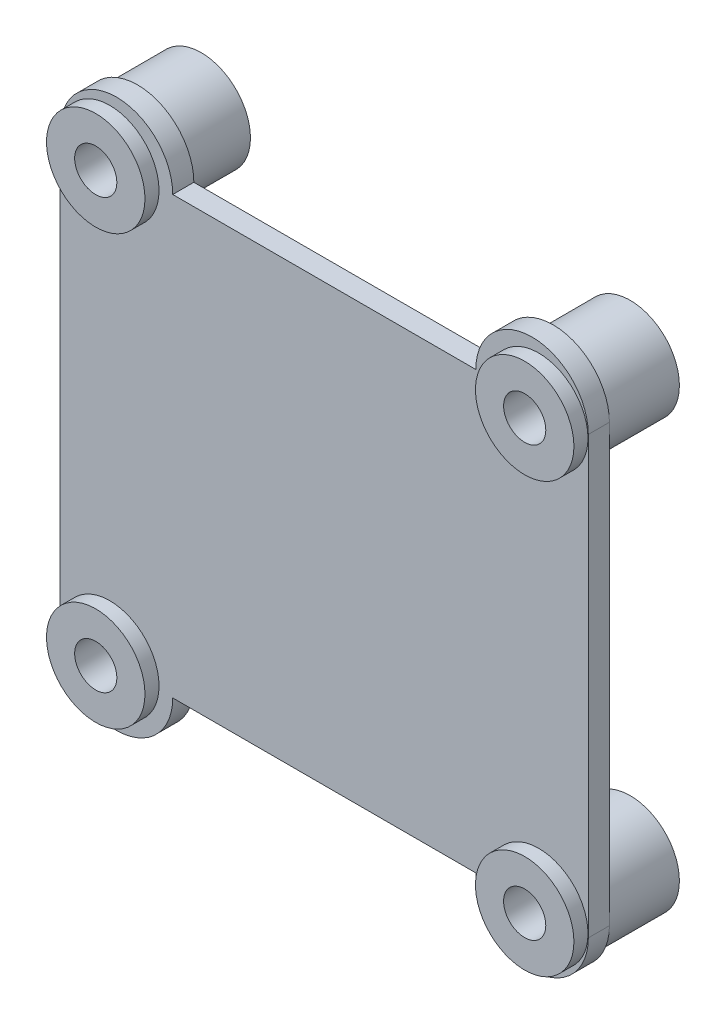
ISO-10303-21;
HEADER;
FILE_DESCRIPTION(('STEP AP214'),'2;1');
FILE_NAME('part.step','',(''),(''),'','','');
FILE_SCHEMA(('AUTOMOTIVE_DESIGN { 1 0 10303 214 1 1 1 1 }'));
ENDSEC;
DATA;
#1=APPLICATION_CONTEXT('core data for automotive mechanical design processes');
#2=APPLICATION_PROTOCOL_DEFINITION('international standard','automotive_design',2000,#1);
#3=PRODUCT_CONTEXT('',#1,'mechanical');
#4=PRODUCT('Part','Part','',(#3));
#5=PRODUCT_RELATED_PRODUCT_CATEGORY('part','',(#4));
#6=PRODUCT_DEFINITION_FORMATION('','',#4);
#7=PRODUCT_DEFINITION_CONTEXT('part definition',#1,'design');
#8=PRODUCT_DEFINITION('design','',#6,#7);
#9=PRODUCT_DEFINITION_SHAPE('','',#8);
#10=(LENGTH_UNIT() NAMED_UNIT(*) SI_UNIT(.MILLI.,.METRE.));
#11=(NAMED_UNIT(*) PLANE_ANGLE_UNIT() SI_UNIT($,.RADIAN.));
#12=(NAMED_UNIT(*) SI_UNIT($,.STERADIAN.) SOLID_ANGLE_UNIT());
#13=UNCERTAINTY_MEASURE_WITH_UNIT(LENGTH_MEASURE(1.E-05),#10,'distance_accuracy_value','');
#14=(GEOMETRIC_REPRESENTATION_CONTEXT(3) GLOBAL_UNCERTAINTY_ASSIGNED_CONTEXT((#13)) GLOBAL_UNIT_ASSIGNED_CONTEXT((#10,
#11,#12)) REPRESENTATION_CONTEXT('',''));
#15=CARTESIAN_POINT('',(0.,0.,0.));
#16=DIRECTION('',(0.,0.,1.));
#17=DIRECTION('',(1.,0.,0.));
#18=AXIS2_PLACEMENT_3D('',#15,#16,#17);
#19=CARTESIAN_POINT('',(13.8832261201287,-17.3040229885057,1.5));
#20=DIRECTION('',(0.,0.,-1.));
#21=DIRECTION('',(-1.,0.,0.));
#22=AXIS2_PLACEMENT_3D('',#19,#20,#21);
#23=PLANE('',#22);
#24=CARTESIAN_POINT('',(14.358226120129,13.4459770114943,1.5));
#25=DIRECTION('',(0.,0.,1.));
#26=DIRECTION('',(1.,0.,0.));
#27=AXIS2_PLACEMENT_3D('',#24,#25,#26);
#28=CIRCLE('',#27,3.5);
#29=CARTESIAN_POINT('',(17.858226120129,13.4459770114943,1.5));
#30=VERTEX_POINT('',#29);
#31=EDGE_CURVE('E283',#30,#30,#28,.T.);
#32=ORIENTED_EDGE('',*,*,#31,.F.);
#33=EDGE_LOOP('',(#32));
#34=FACE_BOUND('',#33,.T.);
#35=CARTESIAN_POINT('',(14.358226120129,-17.0540229885057,1.5));
#36=DIRECTION('',(0.,0.,1.));
#37=DIRECTION('',(1.,0.,0.));
#38=AXIS2_PLACEMENT_3D('',#35,#36,#37);
#39=CIRCLE('',#38,3.5);
#40=CARTESIAN_POINT('',(17.858226120129,-17.0540229885057,1.5));
#41=VERTEX_POINT('',#40);
#42=EDGE_CURVE('E299',#41,#41,#39,.T.);
#43=ORIENTED_EDGE('',*,*,#42,.F.);
#44=EDGE_LOOP('',(#43));
#45=FACE_BOUND('',#44,.T.);
#46=CARTESIAN_POINT('',(-16.141773879871,13.4459770114942,1.5));
#47=DIRECTION('',(0.,0.,1.));
#48=DIRECTION('',(1.,0.,0.));
#49=AXIS2_PLACEMENT_3D('',#46,#47,#48);
#50=CIRCLE('',#49,3.5);
#51=CARTESIAN_POINT('',(-12.641773879871,13.4459770114942,1.5));
#52=VERTEX_POINT('',#51);
#53=EDGE_CURVE('E314',#52,#52,#50,.T.);
#54=ORIENTED_EDGE('',*,*,#53,.F.);
#55=EDGE_LOOP('',(#54));
#56=FACE_BOUND('',#55,.T.);
#57=CARTESIAN_POINT('',(-16.141773879871,-17.0540229885057,1.5));
#58=DIRECTION('',(0.,0.,1.));
#59=DIRECTION('',(1.,0.,0.));
#60=AXIS2_PLACEMENT_3D('',#57,#58,#59);
#61=CIRCLE('',#60,3.5);
#62=CARTESIAN_POINT('',(-12.641773879871,-17.0540229885057,1.5));
#63=VERTEX_POINT('',#62);
#64=EDGE_CURVE('E329',#63,#63,#61,.T.);
#65=ORIENTED_EDGE('',*,*,#64,.F.);
#66=EDGE_LOOP('',(#65));
#67=FACE_BOUND('',#66,.T.);
#68=CARTESIAN_POINT('',(13.8832261201287,-17.3040229885057,1.5));
#69=DIRECTION('',(0.,0.,1.));
#70=DIRECTION('',(-1.,0.,0.));
#71=AXIS2_PLACEMENT_3D('',#68,#69,#70);
#72=CIRCLE('',#71,4.);
#73=CARTESIAN_POINT('',(9.88322612012868,-17.3040229885057,1.5));
#74=VERTEX_POINT('',#73);
#75=CARTESIAN_POINT('',(17.8832261201287,-17.3040229885057,1.5));
#76=VERTEX_POINT('',#75);
#77=EDGE_CURVE('E147',#74,#76,#72,.T.);
#78=ORIENTED_EDGE('',*,*,#77,.T.);
#79=DIRECTION('',(0.,1.,0.));
#80=VECTOR('',#79,1.);
#81=CARTESIAN_POINT('',(17.8832261201287,13.6959770114942,1.5));
#82=LINE('',#81,#80);
#83=CARTESIAN_POINT('',(17.8832261201287,13.6959770114942,1.5));
#84=VERTEX_POINT('',#83);
#85=EDGE_CURVE('E96',#76,#84,#82,.T.);
#86=ORIENTED_EDGE('',*,*,#85,.T.);
#87=CARTESIAN_POINT('',(13.8832261201287,13.6959770114942,1.5));
#88=DIRECTION('',(0.,0.,1.));
#89=DIRECTION('',(1.,0.,0.));
#90=AXIS2_PLACEMENT_3D('',#87,#88,#89);
#91=CIRCLE('',#90,4.);
#92=CARTESIAN_POINT('',(9.88322612012868,13.6959770114942,1.5));
#93=VERTEX_POINT('',#92);
#94=EDGE_CURVE('E345',#84,#93,#91,.T.);
#95=ORIENTED_EDGE('',*,*,#94,.T.);
#96=DIRECTION('',(-1.,0.,0.));
#97=VECTOR('',#96,1.);
#98=CARTESIAN_POINT('',(-11.6667738798713,13.6959770114942,1.5));
#99=LINE('',#98,#97);
#100=CARTESIAN_POINT('',(-11.6667738798713,13.6959770114942,1.5));
#101=VERTEX_POINT('',#100);
#102=EDGE_CURVE('E347',#93,#101,#99,.T.);
#103=ORIENTED_EDGE('',*,*,#102,.T.);
#104=CARTESIAN_POINT('',(-15.6667738798713,13.6959770114942,1.5));
#105=DIRECTION('',(0.,0.,1.));
#106=DIRECTION('',(1.,0.,0.));
#107=AXIS2_PLACEMENT_3D('',#104,#105,#106);
#108=CIRCLE('',#107,4.);
#109=CARTESIAN_POINT('',(-19.6667738798713,13.6959770114942,1.5));
#110=VERTEX_POINT('',#109);
#111=EDGE_CURVE('E114',#101,#110,#108,.T.);
#112=ORIENTED_EDGE('',*,*,#111,.T.);
#113=DIRECTION('',(0.,-1.,0.));
#114=VECTOR('',#113,1.);
#115=CARTESIAN_POINT('',(-19.6667738798713,13.6959770114942,1.5));
#116=LINE('',#115,#114);
#117=CARTESIAN_POINT('',(-19.6667738798713,-17.3040229885057,1.5));
#118=VERTEX_POINT('',#117);
#119=EDGE_CURVE('E109',#110,#118,#116,.T.);
#120=ORIENTED_EDGE('',*,*,#119,.T.);
#121=CARTESIAN_POINT('',(-15.6667738798713,-17.3040229885057,1.5));
#122=DIRECTION('',(0.,0.,1.));
#123=DIRECTION('',(-1.,0.,0.));
#124=AXIS2_PLACEMENT_3D('',#121,#122,#123);
#125=CIRCLE('',#124,4.);
#126=CARTESIAN_POINT('',(-11.6667738798713,-17.3040229885057,1.5));
#127=VERTEX_POINT('',#126);
#128=EDGE_CURVE('E112',#118,#127,#125,.T.);
#129=ORIENTED_EDGE('',*,*,#128,.T.);
#130=DIRECTION('',(1.,0.,0.));
#131=VECTOR('',#130,1.);
#132=CARTESIAN_POINT('',(-11.6667738798713,-17.3040229885057,1.5));
#133=LINE('',#132,#131);
#134=EDGE_CURVE('E52',#127,#74,#133,.T.);
#135=ORIENTED_EDGE('',*,*,#134,.T.);
#136=EDGE_LOOP('',(#78,#86,#95,#103,#112,#120,#129,#135));
#137=FACE_BOUND('',#136,.T.);
#138=ADVANCED_FACE('F35',(#34,#45,#56,#67,#137),#23,.F.);
#139=CARTESIAN_POINT('',(13.8832261201287,-17.3040229885057,0.));
#140=DIRECTION('',(0.,0.,-1.));
#141=DIRECTION('',(-1.,0.,0.));
#142=AXIS2_PLACEMENT_3D('',#139,#140,#141);
#143=PLANE('',#142);
#144=CARTESIAN_POINT('',(14.358226120129,13.4459770114943,0.));
#145=DIRECTION('',(0.,0.,-1.));
#146=DIRECTION('',(-1.,0.,0.));
#147=AXIS2_PLACEMENT_3D('',#144,#145,#146);
#148=CIRCLE('',#147,3.5);
#149=CARTESIAN_POINT('',(10.858226120129,13.4459770114943,0.));
#150=VERTEX_POINT('',#149);
#151=EDGE_CURVE('E11',#150,#150,#148,.T.);
#152=ORIENTED_EDGE('',*,*,#151,.F.);
#153=EDGE_LOOP('',(#152));
#154=FACE_BOUND('',#153,.T.);
#155=CARTESIAN_POINT('',(14.358226120129,-17.0540229885057,0.));
#156=DIRECTION('',(0.,0.,-1.));
#157=DIRECTION('',(-1.,0.,0.));
#158=AXIS2_PLACEMENT_3D('',#155,#156,#157);
#159=CIRCLE('',#158,3.5);
#160=CARTESIAN_POINT('',(10.858226120129,-17.0540229885057,0.));
#161=VERTEX_POINT('',#160);
#162=EDGE_CURVE('E44',#161,#161,#159,.T.);
#163=ORIENTED_EDGE('',*,*,#162,.F.);
#164=EDGE_LOOP('',(#163));
#165=FACE_BOUND('',#164,.T.);
#166=CARTESIAN_POINT('',(-16.141773879871,13.4459770114942,0.));
#167=DIRECTION('',(0.,0.,-1.));
#168=DIRECTION('',(-1.,0.,0.));
#169=AXIS2_PLACEMENT_3D('',#166,#167,#168);
#170=CIRCLE('',#169,3.5);
#171=CARTESIAN_POINT('',(-19.641773879871,13.4459770114942,0.));
#172=VERTEX_POINT('',#171);
#173=EDGE_CURVE('E165',#172,#172,#170,.T.);
#174=ORIENTED_EDGE('',*,*,#173,.F.);
#175=EDGE_LOOP('',(#174));
#176=FACE_BOUND('',#175,.T.);
#177=CARTESIAN_POINT('',(-16.141773879871,-17.0540229885057,0.));
#178=DIRECTION('',(0.,0.,-1.));
#179=DIRECTION('',(-1.,0.,0.));
#180=AXIS2_PLACEMENT_3D('',#177,#178,#179);
#181=CIRCLE('',#180,3.5);
#182=CARTESIAN_POINT('',(-19.641773879871,-17.0540229885057,0.));
#183=VERTEX_POINT('',#182);
#184=EDGE_CURVE('E162',#183,#183,#181,.T.);
#185=ORIENTED_EDGE('',*,*,#184,.F.);
#186=EDGE_LOOP('',(#185));
#187=FACE_BOUND('',#186,.T.);
#188=CARTESIAN_POINT('',(13.8832261201287,-17.3040229885057,0.));
#189=DIRECTION('',(0.,0.,1.));
#190=DIRECTION('',(-1.,0.,0.));
#191=AXIS2_PLACEMENT_3D('',#188,#189,#190);
#192=CIRCLE('',#191,4.);
#193=CARTESIAN_POINT('',(9.88322612012868,-17.3040229885057,0.));
#194=VERTEX_POINT('',#193);
#195=CARTESIAN_POINT('',(17.8832261201287,-17.3040229885057,0.));
#196=VERTEX_POINT('',#195);
#197=EDGE_CURVE('E132',#194,#196,#192,.T.);
#198=ORIENTED_EDGE('',*,*,#197,.F.);
#199=DIRECTION('',(1.,0.,0.));
#200=VECTOR('',#199,1.);
#201=CARTESIAN_POINT('',(-11.6667738798713,-17.3040229885057,0.));
#202=LINE('',#201,#200);
#203=CARTESIAN_POINT('',(-11.6667738798713,-17.3040229885057,0.));
#204=VERTEX_POINT('',#203);
#205=EDGE_CURVE('E87',#204,#194,#202,.T.);
#206=ORIENTED_EDGE('',*,*,#205,.F.);
#207=CARTESIAN_POINT('',(-15.6667738798713,-17.3040229885057,0.));
#208=DIRECTION('',(0.,0.,1.));
#209=DIRECTION('',(-1.,0.,0.));
#210=AXIS2_PLACEMENT_3D('',#207,#208,#209);
#211=CIRCLE('',#210,4.);
#212=CARTESIAN_POINT('',(-19.6667738798713,-17.3040229885057,0.));
#213=VERTEX_POINT('',#212);
#214=EDGE_CURVE('E81',#213,#204,#211,.T.);
#215=ORIENTED_EDGE('',*,*,#214,.F.);
#216=DIRECTION('',(0.,-1.,0.));
#217=VECTOR('',#216,1.);
#218=CARTESIAN_POINT('',(-19.6667738798713,13.6959770114942,0.));
#219=LINE('',#218,#217);
#220=CARTESIAN_POINT('',(-19.6667738798713,13.6959770114942,0.));
#221=VERTEX_POINT('',#220);
#222=EDGE_CURVE('E122',#221,#213,#219,.T.);
#223=ORIENTED_EDGE('',*,*,#222,.F.);
#224=CARTESIAN_POINT('',(-15.6667738798713,13.6959770114942,0.));
#225=DIRECTION('',(0.,0.,1.));
#226=DIRECTION('',(1.,0.,0.));
#227=AXIS2_PLACEMENT_3D('',#224,#225,#226);
#228=CIRCLE('',#227,4.);
#229=CARTESIAN_POINT('',(-11.6667738798713,13.6959770114942,0.));
#230=VERTEX_POINT('',#229);
#231=EDGE_CURVE('E142',#230,#221,#228,.T.);
#232=ORIENTED_EDGE('',*,*,#231,.F.);
#233=DIRECTION('',(-1.,0.,0.));
#234=VECTOR('',#233,1.);
#235=CARTESIAN_POINT('',(-11.6667738798713,13.6959770114942,0.));
#236=LINE('',#235,#234);
#237=CARTESIAN_POINT('',(9.88322612012868,13.6959770114942,0.));
#238=VERTEX_POINT('',#237);
#239=EDGE_CURVE('E140',#238,#230,#236,.T.);
#240=ORIENTED_EDGE('',*,*,#239,.F.);
#241=CARTESIAN_POINT('',(13.8832261201287,13.6959770114942,0.));
#242=DIRECTION('',(0.,0.,1.));
#243=DIRECTION('',(1.,0.,0.));
#244=AXIS2_PLACEMENT_3D('',#241,#242,#243);
#245=CIRCLE('',#244,4.);
#246=CARTESIAN_POINT('',(17.8832261201287,13.6959770114942,0.));
#247=VERTEX_POINT('',#246);
#248=EDGE_CURVE('E138',#247,#238,#245,.T.);
#249=ORIENTED_EDGE('',*,*,#248,.F.);
#250=DIRECTION('',(0.,1.,0.));
#251=VECTOR('',#250,1.);
#252=CARTESIAN_POINT('',(17.8832261201287,13.6959770114942,0.));
#253=LINE('',#252,#251);
#254=EDGE_CURVE('E135',#196,#247,#253,.T.);
#255=ORIENTED_EDGE('',*,*,#254,.F.);
#256=EDGE_LOOP('',(#198,#206,#215,#223,#232,#240,#249,#255));
#257=FACE_BOUND('',#256,.T.);
#258=ADVANCED_FACE('F172',(#154,#165,#176,#187,#257),#143,.T.);
#259=CARTESIAN_POINT('',(13.8832261201287,-17.3040229885057,1.5));
#260=DIRECTION('',(0.,0.,-1.));
#261=DIRECTION('',(-1.,0.,0.));
#262=AXIS2_PLACEMENT_3D('',#259,#260,#261);
#263=CYLINDRICAL_SURFACE('',#262,4.);
#264=ORIENTED_EDGE('',*,*,#197,.T.);
#265=DIRECTION('',(0.,0.,-1.));
#266=VECTOR('',#265,1.);
#267=CARTESIAN_POINT('',(17.8832261201287,-17.3040229885057,1.5));
#268=LINE('',#267,#266);
#269=EDGE_CURVE('E160',#76,#196,#268,.T.);
#270=ORIENTED_EDGE('',*,*,#269,.F.);
#271=ORIENTED_EDGE('',*,*,#77,.F.);
#272=DIRECTION('',(0.,0.,-1.));
#273=VECTOR('',#272,1.);
#274=CARTESIAN_POINT('',(9.88322612012868,-17.3040229885057,1.5));
#275=LINE('',#274,#273);
#276=EDGE_CURVE('E128',#74,#194,#275,.T.);
#277=ORIENTED_EDGE('',*,*,#276,.T.);
#278=EDGE_LOOP('',(#264,#270,#271,#277));
#279=FACE_BOUND('',#278,.T.);
#280=ADVANCED_FACE('F37',(#279),#263,.T.);
#281=CARTESIAN_POINT('',(17.8832261201287,13.6959770114942,1.5));
#282=DIRECTION('',(-1.,0.,0.));
#283=DIRECTION('',(0.,0.,1.));
#284=AXIS2_PLACEMENT_3D('',#281,#282,#283);
#285=PLANE('',#284);
#286=ORIENTED_EDGE('',*,*,#254,.T.);
#287=DIRECTION('',(0.,0.,-1.));
#288=VECTOR('',#287,1.);
#289=CARTESIAN_POINT('',(17.8832261201287,13.6959770114942,1.5));
#290=LINE('',#289,#288);
#291=EDGE_CURVE('E157',#84,#247,#290,.T.);
#292=ORIENTED_EDGE('',*,*,#291,.F.);
#293=ORIENTED_EDGE('',*,*,#85,.F.);
#294=ORIENTED_EDGE('',*,*,#269,.T.);
#295=EDGE_LOOP('',(#286,#292,#293,#294));
#296=FACE_BOUND('',#295,.T.);
#297=ADVANCED_FACE('F360',(#296),#285,.F.);
#298=CARTESIAN_POINT('',(13.8832261201287,13.6959770114942,1.5));
#299=DIRECTION('',(0.,0.,-1.));
#300=DIRECTION('',(-1.,0.,0.));
#301=AXIS2_PLACEMENT_3D('',#298,#299,#300);
#302=CYLINDRICAL_SURFACE('',#301,4.);
#303=ORIENTED_EDGE('',*,*,#248,.T.);
#304=DIRECTION('',(0.,0.,-1.));
#305=VECTOR('',#304,1.);
#306=CARTESIAN_POINT('',(9.88322612012868,13.6959770114942,1.5));
#307=LINE('',#306,#305);
#308=EDGE_CURVE('E154',#93,#238,#307,.T.);
#309=ORIENTED_EDGE('',*,*,#308,.F.);
#310=ORIENTED_EDGE('',*,*,#94,.F.);
#311=ORIENTED_EDGE('',*,*,#291,.T.);
#312=EDGE_LOOP('',(#303,#309,#310,#311));
#313=FACE_BOUND('',#312,.T.);
#314=ADVANCED_FACE('F359',(#313),#302,.T.);
#315=CARTESIAN_POINT('',(-11.6667738798713,13.6959770114942,1.5));
#316=DIRECTION('',(0.,-1.,0.));
#317=DIRECTION('',(0.,0.,-1.));
#318=AXIS2_PLACEMENT_3D('',#315,#316,#317);
#319=PLANE('',#318);
#320=ORIENTED_EDGE('',*,*,#239,.T.);
#321=DIRECTION('',(0.,0.,-1.));
#322=VECTOR('',#321,1.);
#323=CARTESIAN_POINT('',(-11.6667738798713,13.6959770114942,1.5));
#324=LINE('',#323,#322);
#325=EDGE_CURVE('E151',#101,#230,#324,.T.);
#326=ORIENTED_EDGE('',*,*,#325,.F.);
#327=ORIENTED_EDGE('',*,*,#102,.F.);
#328=ORIENTED_EDGE('',*,*,#308,.T.);
#329=EDGE_LOOP('',(#320,#326,#327,#328));
#330=FACE_BOUND('',#329,.T.);
#331=ADVANCED_FACE('F353',(#330),#319,.F.);
#332=CARTESIAN_POINT('',(-15.6667738798713,13.6959770114942,1.5));
#333=DIRECTION('',(0.,0.,-1.));
#334=DIRECTION('',(-1.,0.,0.));
#335=AXIS2_PLACEMENT_3D('',#332,#333,#334);
#336=CYLINDRICAL_SURFACE('',#335,4.);
#337=ORIENTED_EDGE('',*,*,#231,.T.);
#338=DIRECTION('',(0.,0.,-1.));
#339=VECTOR('',#338,1.);
#340=CARTESIAN_POINT('',(-19.6667738798713,13.6959770114942,1.5));
#341=LINE('',#340,#339);
#342=EDGE_CURVE('E123',#110,#221,#341,.T.);
#343=ORIENTED_EDGE('',*,*,#342,.F.);
#344=ORIENTED_EDGE('',*,*,#111,.F.);
#345=ORIENTED_EDGE('',*,*,#325,.T.);
#346=EDGE_LOOP('',(#337,#343,#344,#345));
#347=FACE_BOUND('',#346,.T.);
#348=ADVANCED_FACE('F357',(#347),#336,.T.);
#349=CARTESIAN_POINT('',(-19.6667738798713,13.6959770114942,1.5));
#350=DIRECTION('',(1.,0.,0.));
#351=DIRECTION('',(0.,1.,0.));
#352=AXIS2_PLACEMENT_3D('',#349,#350,#351);
#353=PLANE('',#352);
#354=ORIENTED_EDGE('',*,*,#222,.T.);
#355=DIRECTION('',(0.,0.,-1.));
#356=VECTOR('',#355,1.);
#357=CARTESIAN_POINT('',(-19.6667738798713,-17.3040229885057,1.5));
#358=LINE('',#357,#356);
#359=EDGE_CURVE('E119',#118,#213,#358,.T.);
#360=ORIENTED_EDGE('',*,*,#359,.F.);
#361=ORIENTED_EDGE('',*,*,#119,.F.);
#362=ORIENTED_EDGE('',*,*,#342,.T.);
#363=EDGE_LOOP('',(#354,#360,#361,#362));
#364=FACE_BOUND('',#363,.T.);
#365=ADVANCED_FACE('F120',(#364),#353,.F.);
#366=CARTESIAN_POINT('',(-15.6667738798713,-17.3040229885057,1.5));
#367=DIRECTION('',(0.,0.,-1.));
#368=DIRECTION('',(-1.,0.,0.));
#369=AXIS2_PLACEMENT_3D('',#366,#367,#368);
#370=CYLINDRICAL_SURFACE('',#369,4.);
#371=ORIENTED_EDGE('',*,*,#214,.T.);
#372=DIRECTION('',(0.,0.,-1.));
#373=VECTOR('',#372,1.);
#374=CARTESIAN_POINT('',(-11.6667738798713,-17.3040229885057,1.5));
#375=LINE('',#374,#373);
#376=EDGE_CURVE('E124',#127,#204,#375,.T.);
#377=ORIENTED_EDGE('',*,*,#376,.F.);
#378=ORIENTED_EDGE('',*,*,#128,.F.);
#379=ORIENTED_EDGE('',*,*,#359,.T.);
#380=EDGE_LOOP('',(#371,#377,#378,#379));
#381=FACE_BOUND('',#380,.T.);
#382=ADVANCED_FACE('F126',(#381),#370,.T.);
#383=CARTESIAN_POINT('',(-11.6667738798713,-17.3040229885057,1.5));
#384=DIRECTION('',(0.,1.,0.));
#385=DIRECTION('',(-1.,0.,0.));
#386=AXIS2_PLACEMENT_3D('',#383,#384,#385);
#387=PLANE('',#386);
#388=ORIENTED_EDGE('',*,*,#205,.T.);
#389=ORIENTED_EDGE('',*,*,#276,.F.);
#390=ORIENTED_EDGE('',*,*,#134,.F.);
#391=ORIENTED_EDGE('',*,*,#376,.T.);
#392=EDGE_LOOP('',(#388,#389,#390,#391));
#393=FACE_BOUND('',#392,.T.);
#394=ADVANCED_FACE('F186',(#393),#387,.F.);
#395=CARTESIAN_POINT('',(-16.141773879871,-17.0540229885057,2.5));
#396=DIRECTION('',(0.,0.,1.));
#397=DIRECTION('',(1.,0.,0.));
#398=AXIS2_PLACEMENT_3D('',#395,#396,#397);
#399=CYLINDRICAL_SURFACE('',#398,3.5);
#400=CARTESIAN_POINT('',(-16.141773879871,-17.0540229885057,-5.));
#401=DIRECTION('',(0.,0.,1.));
#402=DIRECTION('',(1.,0.,0.));
#403=AXIS2_PLACEMENT_3D('',#400,#401,#402);
#404=CIRCLE('',#403,3.50000000000001);
#405=CARTESIAN_POINT('',(-12.641773879871,-17.0540229885057,-5.));
#406=VERTEX_POINT('',#405);
#407=EDGE_CURVE('E136',#406,#406,#404,.T.);
#408=ORIENTED_EDGE('',*,*,#407,.T.);
#409=EDGE_LOOP('',(#408));
#410=FACE_BOUND('',#409,.T.);
#411=ORIENTED_EDGE('',*,*,#184,.T.);
#412=EDGE_LOOP('',(#411));
#413=FACE_BOUND('',#412,.T.);
#414=ADVANCED_FACE('F188',(#410,#413),#399,.T.);
#415=CARTESIAN_POINT('',(-17.641773879871,-17.0540229885058,-5.));
#416=DIRECTION('',(0.,0.,-1.));
#417=DIRECTION('',(-1.,0.,0.));
#418=AXIS2_PLACEMENT_3D('',#415,#416,#417);
#419=PLANE('',#418);
#420=CARTESIAN_POINT('',(-16.141773879871,-17.0540229885057,-5.));
#421=DIRECTION('',(0.,0.,1.));
#422=DIRECTION('',(1.,0.,0.));
#423=AXIS2_PLACEMENT_3D('',#420,#421,#422);
#424=CIRCLE('',#423,1.5);
#425=CARTESIAN_POINT('',(-14.641773879871,-17.0540229885057,-5.));
#426=VERTEX_POINT('',#425);
#427=EDGE_CURVE('E338',#426,#426,#424,.T.);
#428=ORIENTED_EDGE('',*,*,#427,.T.);
#429=EDGE_LOOP('',(#428));
#430=FACE_BOUND('',#429,.T.);
#431=ORIENTED_EDGE('',*,*,#407,.F.);
#432=EDGE_LOOP('',(#431));
#433=FACE_BOUND('',#432,.T.);
#434=ADVANCED_FACE('F194',(#430,#433),#419,.T.);
#435=CARTESIAN_POINT('',(-16.141773879871,-17.0540229885057,2.5));
#436=DIRECTION('',(0.,0.,1.));
#437=DIRECTION('',(1.,0.,0.));
#438=AXIS2_PLACEMENT_3D('',#435,#436,#437);
#439=CYLINDRICAL_SURFACE('',#438,1.5);
#440=CARTESIAN_POINT('',(-16.141773879871,-17.0540229885057,2.5));
#441=DIRECTION('',(0.,0.,1.));
#442=DIRECTION('',(1.,0.,0.));
#443=AXIS2_PLACEMENT_3D('',#440,#441,#442);
#444=CIRCLE('',#443,1.5);
#445=CARTESIAN_POINT('',(-14.641773879871,-17.0540229885057,2.5));
#446=VERTEX_POINT('',#445);
#447=EDGE_CURVE('E335',#446,#446,#444,.T.);
#448=ORIENTED_EDGE('',*,*,#447,.T.);
#449=EDGE_LOOP('',(#448));
#450=FACE_BOUND('',#449,.T.);
#451=ORIENTED_EDGE('',*,*,#427,.F.);
#452=EDGE_LOOP('',(#451));
#453=FACE_BOUND('',#452,.T.);
#454=ADVANCED_FACE('F208',(#450,#453),#439,.F.);
#455=CARTESIAN_POINT('',(-19.641773879871,-17.0540229885058,2.5));
#456=DIRECTION('',(0.,0.,1.));
#457=DIRECTION('',(1.,0.,0.));
#458=AXIS2_PLACEMENT_3D('',#455,#456,#457);
#459=PLANE('',#458);
#460=CARTESIAN_POINT('',(-16.141773879871,-17.0540229885057,2.5));
#461=DIRECTION('',(0.,0.,1.));
#462=DIRECTION('',(1.,0.,0.));
#463=AXIS2_PLACEMENT_3D('',#460,#461,#462);
#464=CIRCLE('',#463,3.5);
#465=CARTESIAN_POINT('',(-12.641773879871,-17.0540229885057,2.5));
#466=VERTEX_POINT('',#465);
#467=EDGE_CURVE('E332',#466,#466,#464,.T.);
#468=ORIENTED_EDGE('',*,*,#467,.T.);
#469=EDGE_LOOP('',(#468));
#470=FACE_BOUND('',#469,.T.);
#471=ORIENTED_EDGE('',*,*,#447,.F.);
#472=EDGE_LOOP('',(#471));
#473=FACE_BOUND('',#472,.T.);
#474=ADVANCED_FACE('F212',(#470,#473),#459,.T.);
#475=CARTESIAN_POINT('',(-16.141773879871,-17.0540229885057,2.5));
#476=DIRECTION('',(0.,0.,1.));
#477=DIRECTION('',(1.,0.,0.));
#478=AXIS2_PLACEMENT_3D('',#475,#476,#477);
#479=CYLINDRICAL_SURFACE('',#478,3.5);
#480=ORIENTED_EDGE('',*,*,#64,.T.);
#481=EDGE_LOOP('',(#480));
#482=FACE_BOUND('',#481,.T.);
#483=ORIENTED_EDGE('',*,*,#467,.F.);
#484=EDGE_LOOP('',(#483));
#485=FACE_BOUND('',#484,.T.);
#486=ADVANCED_FACE('F216',(#482,#485),#479,.T.);
#487=CARTESIAN_POINT('',(-16.141773879871,13.4459770114942,2.5));
#488=DIRECTION('',(0.,0.,1.));
#489=DIRECTION('',(1.,0.,0.));
#490=AXIS2_PLACEMENT_3D('',#487,#488,#489);
#491=CYLINDRICAL_SURFACE('',#490,3.5);
#492=CARTESIAN_POINT('',(-16.141773879871,13.4459770114942,-5.));
#493=DIRECTION('',(0.,0.,1.));
#494=DIRECTION('',(1.,0.,0.));
#495=AXIS2_PLACEMENT_3D('',#492,#493,#494);
#496=CIRCLE('',#495,3.50000000000001);
#497=CARTESIAN_POINT('',(-12.641773879871,13.4459770114942,-5.));
#498=VERTEX_POINT('',#497);
#499=EDGE_CURVE('E326',#498,#498,#496,.T.);
#500=ORIENTED_EDGE('',*,*,#499,.T.);
#501=EDGE_LOOP('',(#500));
#502=FACE_BOUND('',#501,.T.);
#503=ORIENTED_EDGE('',*,*,#173,.T.);
#504=EDGE_LOOP('',(#503));
#505=FACE_BOUND('',#504,.T.);
#506=ADVANCED_FACE('F220',(#502,#505),#491,.T.);
#507=CARTESIAN_POINT('',(-17.641773879871,13.4459770114942,-5.));
#508=DIRECTION('',(0.,0.,-1.));
#509=DIRECTION('',(-1.,0.,0.));
#510=AXIS2_PLACEMENT_3D('',#507,#508,#509);
#511=PLANE('',#510);
#512=CARTESIAN_POINT('',(-16.141773879871,13.4459770114942,-5.));
#513=DIRECTION('',(0.,0.,1.));
#514=DIRECTION('',(1.,0.,0.));
#515=AXIS2_PLACEMENT_3D('',#512,#513,#514);
#516=CIRCLE('',#515,1.5);
#517=CARTESIAN_POINT('',(-14.641773879871,13.4459770114942,-5.));
#518=VERTEX_POINT('',#517);
#519=EDGE_CURVE('E323',#518,#518,#516,.T.);
#520=ORIENTED_EDGE('',*,*,#519,.T.);
#521=EDGE_LOOP('',(#520));
#522=FACE_BOUND('',#521,.T.);
#523=ORIENTED_EDGE('',*,*,#499,.F.);
#524=EDGE_LOOP('',(#523));
#525=FACE_BOUND('',#524,.T.);
#526=ADVANCED_FACE('F224',(#522,#525),#511,.T.);
#527=CARTESIAN_POINT('',(-16.141773879871,13.4459770114942,2.5));
#528=DIRECTION('',(0.,0.,1.));
#529=DIRECTION('',(1.,0.,0.));
#530=AXIS2_PLACEMENT_3D('',#527,#528,#529);
#531=CYLINDRICAL_SURFACE('',#530,1.5);
#532=CARTESIAN_POINT('',(-16.141773879871,13.4459770114942,2.5));
#533=DIRECTION('',(0.,0.,1.));
#534=DIRECTION('',(1.,0.,0.));
#535=AXIS2_PLACEMENT_3D('',#532,#533,#534);
#536=CIRCLE('',#535,1.5);
#537=CARTESIAN_POINT('',(-14.641773879871,13.4459770114942,2.5));
#538=VERTEX_POINT('',#537);
#539=EDGE_CURVE('E320',#538,#538,#536,.T.);
#540=ORIENTED_EDGE('',*,*,#539,.T.);
#541=EDGE_LOOP('',(#540));
#542=FACE_BOUND('',#541,.T.);
#543=ORIENTED_EDGE('',*,*,#519,.F.);
#544=EDGE_LOOP('',(#543));
#545=FACE_BOUND('',#544,.T.);
#546=ADVANCED_FACE('F228',(#542,#545),#531,.F.);
#547=CARTESIAN_POINT('',(-19.641773879871,13.4459770114942,2.5));
#548=DIRECTION('',(0.,0.,1.));
#549=DIRECTION('',(1.,0.,0.));
#550=AXIS2_PLACEMENT_3D('',#547,#548,#549);
#551=PLANE('',#550);
#552=CARTESIAN_POINT('',(-16.141773879871,13.4459770114942,2.5));
#553=DIRECTION('',(0.,0.,1.));
#554=DIRECTION('',(1.,0.,0.));
#555=AXIS2_PLACEMENT_3D('',#552,#553,#554);
#556=CIRCLE('',#555,3.5);
#557=CARTESIAN_POINT('',(-12.641773879871,13.4459770114942,2.5));
#558=VERTEX_POINT('',#557);
#559=EDGE_CURVE('E317',#558,#558,#556,.T.);
#560=ORIENTED_EDGE('',*,*,#559,.T.);
#561=EDGE_LOOP('',(#560));
#562=FACE_BOUND('',#561,.T.);
#563=ORIENTED_EDGE('',*,*,#539,.F.);
#564=EDGE_LOOP('',(#563));
#565=FACE_BOUND('',#564,.T.);
#566=ADVANCED_FACE('F232',(#562,#565),#551,.T.);
#567=CARTESIAN_POINT('',(-16.141773879871,13.4459770114942,2.5));
#568=DIRECTION('',(0.,0.,1.));
#569=DIRECTION('',(1.,0.,0.));
#570=AXIS2_PLACEMENT_3D('',#567,#568,#569);
#571=CYLINDRICAL_SURFACE('',#570,3.5);
#572=ORIENTED_EDGE('',*,*,#53,.T.);
#573=EDGE_LOOP('',(#572));
#574=FACE_BOUND('',#573,.T.);
#575=ORIENTED_EDGE('',*,*,#559,.F.);
#576=EDGE_LOOP('',(#575));
#577=FACE_BOUND('',#576,.T.);
#578=ADVANCED_FACE('F236',(#574,#577),#571,.T.);
#579=CARTESIAN_POINT('',(14.358226120129,-17.0540229885057,2.5));
#580=DIRECTION('',(0.,0.,1.));
#581=DIRECTION('',(1.,0.,0.));
#582=AXIS2_PLACEMENT_3D('',#579,#580,#581);
#583=CYLINDRICAL_SURFACE('',#582,3.5);
#584=CARTESIAN_POINT('',(14.358226120129,-17.0540229885057,-5.));
#585=DIRECTION('',(0.,0.,1.));
#586=DIRECTION('',(1.,0.,0.));
#587=AXIS2_PLACEMENT_3D('',#584,#585,#586);
#588=CIRCLE('',#587,3.50000000000001);
#589=CARTESIAN_POINT('',(17.858226120129,-17.0540229885057,-5.));
#590=VERTEX_POINT('',#589);
#591=EDGE_CURVE('E311',#590,#590,#588,.T.);
#592=ORIENTED_EDGE('',*,*,#591,.T.);
#593=EDGE_LOOP('',(#592));
#594=FACE_BOUND('',#593,.T.);
#595=ORIENTED_EDGE('',*,*,#162,.T.);
#596=EDGE_LOOP('',(#595));
#597=FACE_BOUND('',#596,.T.);
#598=ADVANCED_FACE('F170',(#594,#597),#583,.T.);
#599=CARTESIAN_POINT('',(12.858226120129,-17.0540229885057,-5.));
#600=DIRECTION('',(0.,0.,-1.));
#601=DIRECTION('',(-1.,0.,0.));
#602=AXIS2_PLACEMENT_3D('',#599,#600,#601);
#603=PLANE('',#602);
#604=CARTESIAN_POINT('',(14.358226120129,-17.0540229885057,-5.));
#605=DIRECTION('',(0.,0.,1.));
#606=DIRECTION('',(1.,0.,0.));
#607=AXIS2_PLACEMENT_3D('',#604,#605,#606);
#608=CIRCLE('',#607,1.5);
#609=CARTESIAN_POINT('',(15.858226120129,-17.0540229885057,-5.));
#610=VERTEX_POINT('',#609);
#611=EDGE_CURVE('E308',#610,#610,#608,.T.);
#612=ORIENTED_EDGE('',*,*,#611,.T.);
#613=EDGE_LOOP('',(#612));
#614=FACE_BOUND('',#613,.T.);
#615=ORIENTED_EDGE('',*,*,#591,.F.);
#616=EDGE_LOOP('',(#615));
#617=FACE_BOUND('',#616,.T.);
#618=ADVANCED_FACE('F243',(#614,#617),#603,.T.);
#619=CARTESIAN_POINT('',(14.358226120129,-17.0540229885057,2.5));
#620=DIRECTION('',(0.,0.,1.));
#621=DIRECTION('',(1.,0.,0.));
#622=AXIS2_PLACEMENT_3D('',#619,#620,#621);
#623=CYLINDRICAL_SURFACE('',#622,1.5);
#624=CARTESIAN_POINT('',(14.358226120129,-17.0540229885057,2.5));
#625=DIRECTION('',(0.,0.,1.));
#626=DIRECTION('',(1.,0.,0.));
#627=AXIS2_PLACEMENT_3D('',#624,#625,#626);
#628=CIRCLE('',#627,1.5);
#629=CARTESIAN_POINT('',(15.858226120129,-17.0540229885057,2.5));
#630=VERTEX_POINT('',#629);
#631=EDGE_CURVE('E305',#630,#630,#628,.T.);
#632=ORIENTED_EDGE('',*,*,#631,.T.);
#633=EDGE_LOOP('',(#632));
#634=FACE_BOUND('',#633,.T.);
#635=ORIENTED_EDGE('',*,*,#611,.F.);
#636=EDGE_LOOP('',(#635));
#637=FACE_BOUND('',#636,.T.);
#638=ADVANCED_FACE('F247',(#634,#637),#623,.F.);
#639=CARTESIAN_POINT('',(10.858226120129,-17.0540229885057,2.5));
#640=DIRECTION('',(0.,0.,1.));
#641=DIRECTION('',(1.,0.,0.));
#642=AXIS2_PLACEMENT_3D('',#639,#640,#641);
#643=PLANE('',#642);
#644=CARTESIAN_POINT('',(14.358226120129,-17.0540229885057,2.5));
#645=DIRECTION('',(0.,0.,1.));
#646=DIRECTION('',(1.,0.,0.));
#647=AXIS2_PLACEMENT_3D('',#644,#645,#646);
#648=CIRCLE('',#647,3.5);
#649=CARTESIAN_POINT('',(17.858226120129,-17.0540229885057,2.5));
#650=VERTEX_POINT('',#649);
#651=EDGE_CURVE('E302',#650,#650,#648,.T.);
#652=ORIENTED_EDGE('',*,*,#651,.T.);
#653=EDGE_LOOP('',(#652));
#654=FACE_BOUND('',#653,.T.);
#655=ORIENTED_EDGE('',*,*,#631,.F.);
#656=EDGE_LOOP('',(#655));
#657=FACE_BOUND('',#656,.T.);
#658=ADVANCED_FACE('F251',(#654,#657),#643,.T.);
#659=CARTESIAN_POINT('',(14.358226120129,-17.0540229885057,2.5));
#660=DIRECTION('',(0.,0.,1.));
#661=DIRECTION('',(1.,0.,0.));
#662=AXIS2_PLACEMENT_3D('',#659,#660,#661);
#663=CYLINDRICAL_SURFACE('',#662,3.5);
#664=ORIENTED_EDGE('',*,*,#42,.T.);
#665=EDGE_LOOP('',(#664));
#666=FACE_BOUND('',#665,.T.);
#667=ORIENTED_EDGE('',*,*,#651,.F.);
#668=EDGE_LOOP('',(#667));
#669=FACE_BOUND('',#668,.T.);
#670=ADVANCED_FACE('F255',(#666,#669),#663,.T.);
#671=CARTESIAN_POINT('',(14.358226120129,13.4459770114943,2.5));
#672=DIRECTION('',(0.,0.,1.));
#673=DIRECTION('',(1.,0.,0.));
#674=AXIS2_PLACEMENT_3D('',#671,#672,#673);
#675=CYLINDRICAL_SURFACE('',#674,3.5);
#676=CARTESIAN_POINT('',(14.358226120129,13.4459770114943,-5.));
#677=DIRECTION('',(0.,0.,1.));
#678=DIRECTION('',(1.,0.,0.));
#679=AXIS2_PLACEMENT_3D('',#676,#677,#678);
#680=CIRCLE('',#679,3.50000000000001);
#681=CARTESIAN_POINT('',(17.858226120129,13.4459770114943,-5.));
#682=VERTEX_POINT('',#681);
#683=EDGE_CURVE('E296',#682,#682,#680,.T.);
#684=ORIENTED_EDGE('',*,*,#683,.T.);
#685=EDGE_LOOP('',(#684));
#686=FACE_BOUND('',#685,.T.);
#687=ORIENTED_EDGE('',*,*,#151,.T.);
#688=EDGE_LOOP('',(#687));
#689=FACE_BOUND('',#688,.T.);
#690=ADVANCED_FACE('F259',(#686,#689),#675,.T.);
#691=CARTESIAN_POINT('',(12.858226120129,13.4459770114943,-5.));
#692=DIRECTION('',(0.,0.,-1.));
#693=DIRECTION('',(-1.,0.,0.));
#694=AXIS2_PLACEMENT_3D('',#691,#692,#693);
#695=PLANE('',#694);
#696=CARTESIAN_POINT('',(14.358226120129,13.4459770114943,-5.));
#697=DIRECTION('',(0.,0.,1.));
#698=DIRECTION('',(1.,0.,0.));
#699=AXIS2_PLACEMENT_3D('',#696,#697,#698);
#700=CIRCLE('',#699,1.5);
#701=CARTESIAN_POINT('',(15.858226120129,13.4459770114943,-5.));
#702=VERTEX_POINT('',#701);
#703=EDGE_CURVE('E290',#702,#702,#700,.T.);
#704=ORIENTED_EDGE('',*,*,#703,.T.);
#705=EDGE_LOOP('',(#704));
#706=FACE_BOUND('',#705,.T.);
#707=ORIENTED_EDGE('',*,*,#683,.F.);
#708=EDGE_LOOP('',(#707));
#709=FACE_BOUND('',#708,.T.);
#710=ADVANCED_FACE('F263',(#706,#709),#695,.T.);
#711=CARTESIAN_POINT('',(14.358226120129,13.4459770114943,2.5));
#712=DIRECTION('',(0.,0.,1.));
#713=DIRECTION('',(1.,0.,0.));
#714=AXIS2_PLACEMENT_3D('',#711,#712,#713);
#715=CYLINDRICAL_SURFACE('',#714,1.5);
#716=CARTESIAN_POINT('',(14.358226120129,13.4459770114943,2.5));
#717=DIRECTION('',(0.,0.,1.));
#718=DIRECTION('',(1.,0.,0.));
#719=AXIS2_PLACEMENT_3D('',#716,#717,#718);
#720=CIRCLE('',#719,1.5);
#721=CARTESIAN_POINT('',(15.858226120129,13.4459770114943,2.5));
#722=VERTEX_POINT('',#721);
#723=EDGE_CURVE('E287',#722,#722,#720,.T.);
#724=ORIENTED_EDGE('',*,*,#723,.T.);
#725=EDGE_LOOP('',(#724));
#726=FACE_BOUND('',#725,.T.);
#727=ORIENTED_EDGE('',*,*,#703,.F.);
#728=EDGE_LOOP('',(#727));
#729=FACE_BOUND('',#728,.T.);
#730=ADVANCED_FACE('F267',(#726,#729),#715,.F.);
#731=CARTESIAN_POINT('',(10.858226120129,13.4459770114943,2.5));
#732=DIRECTION('',(0.,0.,1.));
#733=DIRECTION('',(1.,0.,0.));
#734=AXIS2_PLACEMENT_3D('',#731,#732,#733);
#735=PLANE('',#734);
#736=CARTESIAN_POINT('',(14.358226120129,13.4459770114943,2.5));
#737=DIRECTION('',(0.,0.,1.));
#738=DIRECTION('',(1.,0.,0.));
#739=AXIS2_PLACEMENT_3D('',#736,#737,#738);
#740=CIRCLE('',#739,3.5);
#741=CARTESIAN_POINT('',(17.858226120129,13.4459770114943,2.5));
#742=VERTEX_POINT('',#741);
#743=EDGE_CURVE('E286',#742,#742,#740,.T.);
#744=ORIENTED_EDGE('',*,*,#743,.T.);
#745=EDGE_LOOP('',(#744));
#746=FACE_BOUND('',#745,.T.);
#747=ORIENTED_EDGE('',*,*,#723,.F.);
#748=EDGE_LOOP('',(#747));
#749=FACE_BOUND('',#748,.T.);
#750=ADVANCED_FACE('F271',(#746,#749),#735,.T.);
#751=CARTESIAN_POINT('',(14.358226120129,13.4459770114943,2.5));
#752=DIRECTION('',(0.,0.,1.));
#753=DIRECTION('',(1.,0.,0.));
#754=AXIS2_PLACEMENT_3D('',#751,#752,#753);
#755=CYLINDRICAL_SURFACE('',#754,3.5);
#756=ORIENTED_EDGE('',*,*,#31,.T.);
#757=EDGE_LOOP('',(#756));
#758=FACE_BOUND('',#757,.T.);
#759=ORIENTED_EDGE('',*,*,#743,.F.);
#760=EDGE_LOOP('',(#759));
#761=FACE_BOUND('',#760,.T.);
#762=ADVANCED_FACE('F275',(#758,#761),#755,.T.);
#763=CLOSED_SHELL('',(#138,#258,#280,#297,#314,#331,#348,#365,#382,#394,#414,#434,#454,#474,
#486,#506,#526,#546,#566,#578,#598,#618,#638,#658,#670,#690,#710,#730,#750,#762));
#764=MANIFOLD_SOLID_BREP('B2',#763);
#765=ADVANCED_BREP_SHAPE_REPRESENTATION('',(#18,#764),#14);
#766=SHAPE_DEFINITION_REPRESENTATION(#9,#765);
ENDSEC;
END-ISO-10303-21;
